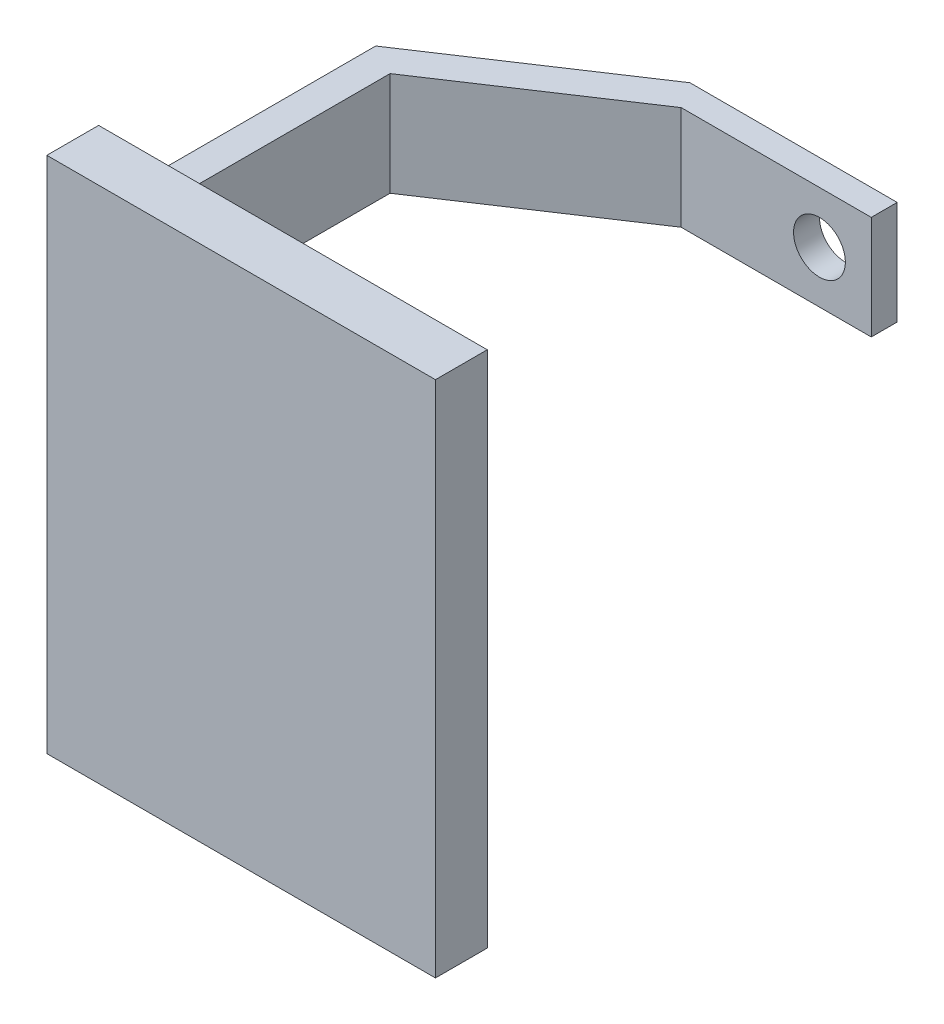
ISO-10303-21;
HEADER;
FILE_DESCRIPTION(('STEP AP214'),'2;1');
FILE_NAME('part.step','',(''),(''),'','','');
FILE_SCHEMA(('AUTOMOTIVE_DESIGN { 1 0 10303 214 1 1 1 1 }'));
ENDSEC;
DATA;
#1=APPLICATION_CONTEXT('core data for automotive mechanical design processes');
#2=APPLICATION_PROTOCOL_DEFINITION('international standard','automotive_design',2000,#1);
#3=PRODUCT_CONTEXT('',#1,'mechanical');
#4=PRODUCT('Part','Part','',(#3));
#5=PRODUCT_RELATED_PRODUCT_CATEGORY('part','',(#4));
#6=PRODUCT_DEFINITION_FORMATION('','',#4);
#7=PRODUCT_DEFINITION_CONTEXT('part definition',#1,'design');
#8=PRODUCT_DEFINITION('design','',#6,#7);
#9=PRODUCT_DEFINITION_SHAPE('','',#8);
#10=(LENGTH_UNIT() NAMED_UNIT(*) SI_UNIT(.MILLI.,.METRE.));
#11=(NAMED_UNIT(*) PLANE_ANGLE_UNIT() SI_UNIT($,.RADIAN.));
#12=(NAMED_UNIT(*) SI_UNIT($,.STERADIAN.) SOLID_ANGLE_UNIT());
#13=UNCERTAINTY_MEASURE_WITH_UNIT(LENGTH_MEASURE(1.E-05),#10,'distance_accuracy_value','');
#14=(GEOMETRIC_REPRESENTATION_CONTEXT(3) GLOBAL_UNCERTAINTY_ASSIGNED_CONTEXT((#13)) GLOBAL_UNIT_ASSIGNED_CONTEXT((#10,
#11,#12)) REPRESENTATION_CONTEXT('',''));
#15=CARTESIAN_POINT('',(0.,0.,0.));
#16=DIRECTION('',(0.,0.,1.));
#17=DIRECTION('',(1.,0.,0.));
#18=AXIS2_PLACEMENT_3D('',#15,#16,#17);
#19=CARTESIAN_POINT('',(0.,0.,5.));
#20=DIRECTION('',(0.,0.,-1.));
#21=DIRECTION('',(-1.,0.,0.));
#22=AXIS2_PLACEMENT_3D('',#19,#20,#21);
#23=PLANE('',#22);
#24=DIRECTION('',(-1.,0.,0.));
#25=VECTOR('',#24,1.);
#26=CARTESIAN_POINT('',(10.,10.,5.));
#27=LINE('',#26,#25);
#28=CARTESIAN_POINT('',(10.,10.,5.));
#29=VERTEX_POINT('',#28);
#30=CARTESIAN_POINT('',(-26.6833752096446,10.,5.));
#31=VERTEX_POINT('',#30);
#32=EDGE_CURVE('E55',#29,#31,#27,.T.);
#33=ORIENTED_EDGE('',*,*,#32,.T.);
#34=DIRECTION('',(0.,-1.,0.));
#35=VECTOR('',#34,1.);
#36=CARTESIAN_POINT('',(-26.6833752096446,162.796467718912,5.));
#37=LINE('',#36,#35);
#38=CARTESIAN_POINT('',(-26.6833752096446,-10.,5.));
#39=VERTEX_POINT('',#38);
#40=EDGE_CURVE('E50',#31,#39,#37,.T.);
#41=ORIENTED_EDGE('',*,*,#40,.T.);
#42=DIRECTION('',(1.,0.,0.));
#43=VECTOR('',#42,1.);
#44=CARTESIAN_POINT('',(10.,-10.,5.));
#45=LINE('',#44,#43);
#46=CARTESIAN_POINT('',(10.,-10.,5.));
#47=VERTEX_POINT('',#46);
#48=EDGE_CURVE('E255',#39,#47,#45,.T.);
#49=ORIENTED_EDGE('',*,*,#48,.T.);
#50=DIRECTION('',(0.,1.,0.));
#51=VECTOR('',#50,1.);
#52=CARTESIAN_POINT('',(10.,10.,5.));
#53=LINE('',#52,#51);
#54=EDGE_CURVE('E257',#47,#29,#53,.T.);
#55=ORIENTED_EDGE('',*,*,#54,.T.);
#56=EDGE_LOOP('',(#33,#41,#49,#55));
#57=FACE_BOUND('',#56,.T.);
#58=CARTESIAN_POINT('',(0.,0.,5.));
#59=DIRECTION('',(0.,0.,1.));
#60=DIRECTION('',(1.,0.,0.));
#61=AXIS2_PLACEMENT_3D('',#58,#59,#60);
#62=CIRCLE('',#61,5.);
#63=CARTESIAN_POINT('',(5.,0.,5.));
#64=VERTEX_POINT('',#63);
#65=EDGE_CURVE('E249',#64,#64,#62,.T.);
#66=ORIENTED_EDGE('',*,*,#65,.F.);
#67=EDGE_LOOP('',(#66));
#68=FACE_BOUND('',#67,.T.);
#69=ADVANCED_FACE('F35',(#57,#68),#23,.F.);
#70=CARTESIAN_POINT('',(0.,0.,0.));
#71=DIRECTION('',(0.,0.,-1.));
#72=DIRECTION('',(-1.,0.,0.));
#73=AXIS2_PLACEMENT_3D('',#70,#71,#72);
#74=PLANE('',#73);
#75=DIRECTION('',(1.,0.,0.));
#76=VECTOR('',#75,1.);
#77=CARTESIAN_POINT('',(10.,-10.,0.));
#78=LINE('',#77,#76);
#79=CARTESIAN_POINT('',(-30.,-10.,0.));
#80=VERTEX_POINT('',#79);
#81=CARTESIAN_POINT('',(10.,-10.,0.));
#82=VERTEX_POINT('',#81);
#83=EDGE_CURVE('E252',#80,#82,#78,.T.);
#84=ORIENTED_EDGE('',*,*,#83,.F.);
#85=DIRECTION('',(0.,-1.,0.));
#86=VECTOR('',#85,1.);
#87=CARTESIAN_POINT('',(-30.,10.,0.));
#88=LINE('',#87,#86);
#89=CARTESIAN_POINT('',(-30.,10.,0.));
#90=VERTEX_POINT('',#89);
#91=EDGE_CURVE('E215',#90,#80,#88,.T.);
#92=ORIENTED_EDGE('',*,*,#91,.F.);
#93=DIRECTION('',(-1.,0.,0.));
#94=VECTOR('',#93,1.);
#95=CARTESIAN_POINT('',(10.,10.,0.));
#96=LINE('',#95,#94);
#97=CARTESIAN_POINT('',(10.,10.,0.));
#98=VERTEX_POINT('',#97);
#99=EDGE_CURVE('E258',#98,#90,#96,.T.);
#100=ORIENTED_EDGE('',*,*,#99,.F.);
#101=DIRECTION('',(0.,1.,0.));
#102=VECTOR('',#101,1.);
#103=CARTESIAN_POINT('',(10.,10.,0.));
#104=LINE('',#103,#102);
#105=EDGE_CURVE('E262',#82,#98,#104,.T.);
#106=ORIENTED_EDGE('',*,*,#105,.F.);
#107=EDGE_LOOP('',(#84,#92,#100,#106));
#108=FACE_BOUND('',#107,.T.);
#109=CARTESIAN_POINT('',(0.,0.,0.));
#110=DIRECTION('',(0.,0.,1.));
#111=DIRECTION('',(1.,0.,0.));
#112=AXIS2_PLACEMENT_3D('',#109,#110,#111);
#113=CIRCLE('',#112,5.);
#114=CARTESIAN_POINT('',(5.,0.,0.));
#115=VERTEX_POINT('',#114);
#116=EDGE_CURVE('E248',#115,#115,#113,.T.);
#117=ORIENTED_EDGE('',*,*,#116,.T.);
#118=EDGE_LOOP('',(#117));
#119=FACE_BOUND('',#118,.T.);
#120=ADVANCED_FACE('F274',(#108,#119),#74,.T.);
#121=CARTESIAN_POINT('',(10.,-10.,5.));
#122=DIRECTION('',(0.,1.,0.));
#123=DIRECTION('',(-1.,0.,0.));
#124=AXIS2_PLACEMENT_3D('',#121,#122,#123);
#125=PLANE('',#124);
#126=DIRECTION('',(0.552770798392566,0.,0.833333333333334));
#127=VECTOR('',#126,1.);
#128=CARTESIAN_POINT('',(-75.3230460875867,-10.,49.9636563878344));
#129=LINE('',#128,#127);
#130=CARTESIAN_POINT('',(-60.4575961545631,-10.,72.3741653731313));
#131=VERTEX_POINT('',#130);
#132=CARTESIAN_POINT('',(-39.3578474124308,-10.,104.183233440598));
#133=VERTEX_POINT('',#132);
#134=EDGE_CURVE('E152',#131,#133,#129,.T.);
#135=ORIENTED_EDGE('',*,*,#134,.T.);
#136=DIRECTION('',(-1.,0.,0.));
#137=VECTOR('',#136,1.);
#138=CARTESIAN_POINT('',(10.,-10.,104.183233440598));
#139=LINE('',#138,#137);
#140=CARTESIAN_POINT('',(-39.9245978317199,-10.,104.183233440598));
#141=VERTEX_POINT('',#140);
#142=EDGE_CURVE('E184',#133,#141,#139,.T.);
#143=ORIENTED_EDGE('',*,*,#142,.T.);
#144=DIRECTION('',(0.,0.,1.));
#145=VECTOR('',#144,1.);
#146=CARTESIAN_POINT('',(-39.9245978317199,-10.,5.));
#147=LINE('',#146,#145);
#148=CARTESIAN_POINT('',(-39.9245978317199,-10.,114.183233440598));
#149=VERTEX_POINT('',#148);
#150=EDGE_CURVE('E195',#141,#149,#147,.T.);
#151=ORIENTED_EDGE('',*,*,#150,.T.);
#152=DIRECTION('',(0.552770798392566,0.,0.833333333333334));
#153=VECTOR('',#152,1.);
#154=CARTESIAN_POINT('',(-80.3230460875867,-10.,53.2802811781898));
#155=LINE('',#154,#153);
#156=CARTESIAN_POINT('',(-66.4575961545632,-10.,74.1832334405978));
#157=VERTEX_POINT('',#156);
#158=EDGE_CURVE('E198',#157,#149,#155,.T.);
#159=ORIENTED_EDGE('',*,*,#158,.F.);
#160=DIRECTION('',(0.,0.,1.));
#161=VECTOR('',#160,1.);
#162=CARTESIAN_POINT('',(-66.457596154563,-10.,-1.66011195177082E-13));
#163=LINE('',#162,#161);
#164=CARTESIAN_POINT('',(-66.4575961545631,-10.,24.1832334405979));
#165=VERTEX_POINT('',#164);
#166=EDGE_CURVE('E218',#165,#157,#163,.T.);
#167=ORIENTED_EDGE('',*,*,#166,.F.);
#168=DIRECTION('',(-0.833333333333333,0.,0.552770798392567));
#169=VECTOR('',#168,1.);
#170=CARTESIAN_POINT('',(-9.16666666666666,-10.,-13.8192699598142));
#171=LINE('',#170,#169);
#172=EDGE_CURVE('E221',#80,#165,#171,.T.);
#173=ORIENTED_EDGE('',*,*,#172,.F.);
#174=ORIENTED_EDGE('',*,*,#83,.T.);
#175=DIRECTION('',(0.,0.,-1.));
#176=VECTOR('',#175,1.);
#177=CARTESIAN_POINT('',(10.,-10.,5.));
#178=LINE('',#177,#176);
#179=EDGE_CURVE('E11',#47,#82,#178,.T.);
#180=ORIENTED_EDGE('',*,*,#179,.F.);
#181=ORIENTED_EDGE('',*,*,#48,.F.);
#182=DIRECTION('',(-0.833333333333333,0.,0.552770798392567));
#183=VECTOR('',#182,1.);
#184=CARTESIAN_POINT('',(-5.85004187631126,-10.,-8.81926995981417));
#185=LINE('',#184,#183);
#186=CARTESIAN_POINT('',(-60.4575961545631,-10.,27.4032836921714));
#187=VERTEX_POINT('',#186);
#188=EDGE_CURVE('E224',#39,#187,#185,.T.);
#189=ORIENTED_EDGE('',*,*,#188,.T.);
#190=DIRECTION('',(0.,0.,1.));
#191=VECTOR('',#190,1.);
#192=CARTESIAN_POINT('',(-60.4575961545631,-10.,0.));
#193=LINE('',#192,#191);
#194=EDGE_CURVE('E227',#187,#131,#193,.T.);
#195=ORIENTED_EDGE('',*,*,#194,.T.);
#196=EDGE_LOOP('',(#135,#143,#151,#159,#167,#173,#174,#180,#181,#189,#195));
#197=FACE_BOUND('',#196,.T.);
#198=ADVANCED_FACE('F37',(#197),#125,.F.);
#199=CARTESIAN_POINT('',(10.,10.,5.));
#200=DIRECTION('',(-1.,0.,0.));
#201=DIRECTION('',(0.,-1.,0.));
#202=AXIS2_PLACEMENT_3D('',#199,#200,#201);
#203=PLANE('',#202);
#204=ORIENTED_EDGE('',*,*,#105,.T.);
#205=DIRECTION('',(0.,0.,-1.));
#206=VECTOR('',#205,1.);
#207=CARTESIAN_POINT('',(10.,10.,5.));
#208=LINE('',#207,#206);
#209=EDGE_CURVE('E43',#29,#98,#208,.T.);
#210=ORIENTED_EDGE('',*,*,#209,.F.);
#211=ORIENTED_EDGE('',*,*,#54,.F.);
#212=ORIENTED_EDGE('',*,*,#179,.T.);
#213=EDGE_LOOP('',(#204,#210,#211,#212));
#214=FACE_BOUND('',#213,.T.);
#215=ADVANCED_FACE('F314',(#214),#203,.F.);
#216=CARTESIAN_POINT('',(10.,10.,5.));
#217=DIRECTION('',(0.,-1.,0.));
#218=DIRECTION('',(0.,0.,-1.));
#219=AXIS2_PLACEMENT_3D('',#216,#217,#218);
#220=PLANE('',#219);
#221=DIRECTION('',(0.,0.,-1.));
#222=VECTOR('',#221,1.);
#223=CARTESIAN_POINT('',(-39.9245978317199,10.,5.));
#224=LINE('',#223,#222);
#225=CARTESIAN_POINT('',(-39.9245978317199,10.,114.183233440598));
#226=VERTEX_POINT('',#225);
#227=CARTESIAN_POINT('',(-39.9245978317199,10.,104.183233440598));
#228=VERTEX_POINT('',#227);
#229=EDGE_CURVE('E190',#226,#228,#224,.T.);
#230=ORIENTED_EDGE('',*,*,#229,.T.);
#231=DIRECTION('',(1.,0.,0.));
#232=VECTOR('',#231,1.);
#233=CARTESIAN_POINT('',(10.,10.,104.183233440598));
#234=LINE('',#233,#232);
#235=CARTESIAN_POINT('',(-39.3578474124308,10.,104.183233440598));
#236=VERTEX_POINT('',#235);
#237=EDGE_CURVE('E188',#228,#236,#234,.T.);
#238=ORIENTED_EDGE('',*,*,#237,.T.);
#239=DIRECTION('',(-0.552770798392566,0.,-0.833333333333334));
#240=VECTOR('',#239,1.);
#241=CARTESIAN_POINT('',(-75.3230460875867,10.,49.9636563878344));
#242=LINE('',#241,#240);
#243=CARTESIAN_POINT('',(-60.4575961545631,10.,72.3741653731313));
#244=VERTEX_POINT('',#243);
#245=EDGE_CURVE('E213',#236,#244,#242,.T.);
#246=ORIENTED_EDGE('',*,*,#245,.T.);
#247=DIRECTION('',(0.,0.,-1.));
#248=VECTOR('',#247,1.);
#249=CARTESIAN_POINT('',(-60.4575961545631,10.,0.));
#250=LINE('',#249,#248);
#251=CARTESIAN_POINT('',(-60.4575961545631,10.,27.4032836921715));
#252=VERTEX_POINT('',#251);
#253=EDGE_CURVE('E211',#244,#252,#250,.T.);
#254=ORIENTED_EDGE('',*,*,#253,.T.);
#255=DIRECTION('',(0.833333333333333,0.,-0.552770798392567));
#256=VECTOR('',#255,1.);
#257=CARTESIAN_POINT('',(-5.85004187631129,10.,-8.81926995981415));
#258=LINE('',#257,#256);
#259=EDGE_CURVE('E209',#252,#31,#258,.T.);
#260=ORIENTED_EDGE('',*,*,#259,.T.);
#261=ORIENTED_EDGE('',*,*,#32,.F.);
#262=ORIENTED_EDGE('',*,*,#209,.T.);
#263=ORIENTED_EDGE('',*,*,#99,.T.);
#264=DIRECTION('',(0.833333333333333,0.,-0.552770798392567));
#265=VECTOR('',#264,1.);
#266=CARTESIAN_POINT('',(-9.16666666666668,10.,-13.8192699598142));
#267=LINE('',#266,#265);
#268=CARTESIAN_POINT('',(-66.4575961545631,10.,24.1832334405979));
#269=VERTEX_POINT('',#268);
#270=EDGE_CURVE('E206',#269,#90,#267,.T.);
#271=ORIENTED_EDGE('',*,*,#270,.F.);
#272=DIRECTION('',(0.,0.,-1.));
#273=VECTOR('',#272,1.);
#274=CARTESIAN_POINT('',(-66.457596154563,10.,-1.66011195177082E-13));
#275=LINE('',#274,#273);
#276=CARTESIAN_POINT('',(-66.4575961545632,10.,74.1832334405978));
#277=VERTEX_POINT('',#276);
#278=EDGE_CURVE('E202',#277,#269,#275,.T.);
#279=ORIENTED_EDGE('',*,*,#278,.F.);
#280=DIRECTION('',(-0.552770798392566,0.,-0.833333333333333));
#281=VECTOR('',#280,1.);
#282=CARTESIAN_POINT('',(-80.3230460875867,10.,53.2802811781898));
#283=LINE('',#282,#281);
#284=EDGE_CURVE('E199',#226,#277,#283,.T.);
#285=ORIENTED_EDGE('',*,*,#284,.F.);
#286=EDGE_LOOP('',(#230,#238,#246,#254,#260,#261,#262,#263,#271,#279,#285));
#287=FACE_BOUND('',#286,.T.);
#288=ADVANCED_FACE('F269',(#287),#220,.F.);
#289=CARTESIAN_POINT('',(0.,0.,5.));
#290=DIRECTION('',(0.,0.,-1.));
#291=DIRECTION('',(-1.,0.,0.));
#292=AXIS2_PLACEMENT_3D('',#289,#290,#291);
#293=CYLINDRICAL_SURFACE('',#292,5.);
#294=ORIENTED_EDGE('',*,*,#65,.T.);
#295=EDGE_LOOP('',(#294));
#296=FACE_BOUND('',#295,.T.);
#297=ORIENTED_EDGE('',*,*,#116,.F.);
#298=EDGE_LOOP('',(#297));
#299=FACE_BOUND('',#298,.T.);
#300=ADVANCED_FACE('F320',(#296,#299),#293,.F.);
#301=CARTESIAN_POINT('',(2.46439903165538E-13,162.796467718912,114.183233440598));
#302=DIRECTION('',(0.,0.,-1.));
#303=DIRECTION('',(-1.,0.,0.));
#304=AXIS2_PLACEMENT_3D('',#301,#302,#303);
#305=PLANE('',#304);
#306=DIRECTION('',(0.,-1.,0.));
#307=VECTOR('',#306,1.);
#308=CARTESIAN_POINT('',(35.0754021682797,162.796467718912,114.183233440598));
#309=LINE('',#308,#307);
#310=CARTESIAN_POINT('',(35.0754021682797,50.,114.183233440598));
#311=VERTEX_POINT('',#310);
#312=CARTESIAN_POINT('',(35.0754021682797,-50.,114.183233440598));
#313=VERTEX_POINT('',#312);
#314=EDGE_CURVE('E141',#311,#313,#309,.T.);
#315=ORIENTED_EDGE('',*,*,#314,.F.);
#316=DIRECTION('',(-1.,0.,0.));
#317=VECTOR('',#316,1.);
#318=CARTESIAN_POINT('',(35.0754021682797,50.,114.183233440598));
#319=LINE('',#318,#317);
#320=CARTESIAN_POINT('',(-39.9245978317199,50.,114.183233440598));
#321=VERTEX_POINT('',#320);
#322=EDGE_CURVE('E173',#311,#321,#319,.T.);
#323=ORIENTED_EDGE('',*,*,#322,.T.);
#324=DIRECTION('',(0.,-1.,0.));
#325=VECTOR('',#324,1.);
#326=CARTESIAN_POINT('',(-39.9245978317199,50.,114.183233440598));
#327=LINE('',#326,#325);
#328=EDGE_CURVE('E186',#321,#226,#327,.T.);
#329=ORIENTED_EDGE('',*,*,#328,.T.);
#330=DIRECTION('',(0.,-1.,0.));
#331=VECTOR('',#330,1.);
#332=CARTESIAN_POINT('',(-39.9245978317199,162.796467718912,114.183233440598));
#333=LINE('',#332,#331);
#334=EDGE_CURVE('E151',#226,#149,#333,.T.);
#335=ORIENTED_EDGE('',*,*,#334,.T.);
#336=CARTESIAN_POINT('',(-39.9245978317199,-50.,114.183233440598));
#337=VERTEX_POINT('',#336);
#338=EDGE_CURVE('E158',#149,#337,#327,.T.);
#339=ORIENTED_EDGE('',*,*,#338,.T.);
#340=DIRECTION('',(-1.,0.,0.));
#341=VECTOR('',#340,1.);
#342=CARTESIAN_POINT('',(35.0754021682797,-50.,114.183233440598));
#343=LINE('',#342,#341);
#344=EDGE_CURVE('E155',#313,#337,#343,.T.);
#345=ORIENTED_EDGE('',*,*,#344,.F.);
#346=EDGE_LOOP('',(#315,#323,#329,#335,#339,#345));
#347=FACE_BOUND('',#346,.T.);
#348=ADVANCED_FACE('F156',(#347),#305,.F.);
#349=CARTESIAN_POINT('',(-80.3230460875867,162.796467718912,53.2802811781898));
#350=DIRECTION('',(0.833333333333334,0.,-0.552770798392566));
#351=DIRECTION('',(-0.552770798392566,0.,-0.833333333333333));
#352=AXIS2_PLACEMENT_3D('',#349,#350,#351);
#353=PLANE('',#352);
#354=ORIENTED_EDGE('',*,*,#334,.F.);
#355=ORIENTED_EDGE('',*,*,#284,.T.);
#356=DIRECTION('',(0.,-1.,0.));
#357=VECTOR('',#356,1.);
#358=CARTESIAN_POINT('',(-66.4575961545632,162.796467718912,74.1832334405978));
#359=LINE('',#358,#357);
#360=EDGE_CURVE('E243',#277,#157,#359,.T.);
#361=ORIENTED_EDGE('',*,*,#360,.T.);
#362=ORIENTED_EDGE('',*,*,#158,.T.);
#363=EDGE_LOOP('',(#354,#355,#361,#362));
#364=FACE_BOUND('',#363,.T.);
#365=ADVANCED_FACE('F291',(#364),#353,.F.);
#366=CARTESIAN_POINT('',(-66.4575961545631,162.796467718912,-1.66011195177082E-13));
#367=DIRECTION('',(1.,0.,0.));
#368=DIRECTION('',(0.,0.,-1.));
#369=AXIS2_PLACEMENT_3D('',#366,#367,#368);
#370=PLANE('',#369);
#371=ORIENTED_EDGE('',*,*,#360,.F.);
#372=ORIENTED_EDGE('',*,*,#278,.T.);
#373=DIRECTION('',(0.,-1.,0.));
#374=VECTOR('',#373,1.);
#375=CARTESIAN_POINT('',(-66.4575961545631,162.796467718912,24.1832334405979));
#376=LINE('',#375,#374);
#377=EDGE_CURVE('E241',#269,#165,#376,.T.);
#378=ORIENTED_EDGE('',*,*,#377,.T.);
#379=ORIENTED_EDGE('',*,*,#166,.T.);
#380=EDGE_LOOP('',(#371,#372,#378,#379));
#381=FACE_BOUND('',#380,.T.);
#382=ADVANCED_FACE('F286',(#381),#370,.F.);
#383=CARTESIAN_POINT('',(-9.16666666666669,162.796467718912,-13.8192699598142));
#384=DIRECTION('',(0.552770798392567,0.,0.833333333333333));
#385=DIRECTION('',(0.833333333333333,0.,-0.552770798392567));
#386=AXIS2_PLACEMENT_3D('',#383,#384,#385);
#387=PLANE('',#386);
#388=ORIENTED_EDGE('',*,*,#377,.F.);
#389=ORIENTED_EDGE('',*,*,#270,.T.);
#390=ORIENTED_EDGE('',*,*,#91,.T.);
#391=ORIENTED_EDGE('',*,*,#172,.T.);
#392=EDGE_LOOP('',(#388,#389,#390,#391));
#393=FACE_BOUND('',#392,.T.);
#394=ADVANCED_FACE('F279',(#393),#387,.F.);
#395=CARTESIAN_POINT('',(-5.85004187631129,162.796467718912,-8.81926995981417));
#396=DIRECTION('',(0.552770798392567,0.,0.833333333333333));
#397=DIRECTION('',(0.833333333333333,0.,-0.552770798392567));
#398=AXIS2_PLACEMENT_3D('',#395,#396,#397);
#399=PLANE('',#398);
#400=ORIENTED_EDGE('',*,*,#259,.F.);
#401=DIRECTION('',(0.,-1.,0.));
#402=VECTOR('',#401,1.);
#403=CARTESIAN_POINT('',(-60.4575961545631,162.796467718912,27.4032836921714));
#404=LINE('',#403,#402);
#405=EDGE_CURVE('E238',#252,#187,#404,.T.);
#406=ORIENTED_EDGE('',*,*,#405,.T.);
#407=ORIENTED_EDGE('',*,*,#188,.F.);
#408=ORIENTED_EDGE('',*,*,#40,.F.);
#409=EDGE_LOOP('',(#400,#406,#407,#408));
#410=FACE_BOUND('',#409,.T.);
#411=ADVANCED_FACE('F312',(#410),#399,.T.);
#412=CARTESIAN_POINT('',(-60.4575961545631,162.796467718912,0.));
#413=DIRECTION('',(1.,0.,0.));
#414=DIRECTION('',(0.,0.,-1.));
#415=AXIS2_PLACEMENT_3D('',#412,#413,#414);
#416=PLANE('',#415);
#417=ORIENTED_EDGE('',*,*,#253,.F.);
#418=DIRECTION('',(0.,-1.,0.));
#419=VECTOR('',#418,1.);
#420=CARTESIAN_POINT('',(-60.4575961545631,162.796467718912,72.3741653731313));
#421=LINE('',#420,#419);
#422=EDGE_CURVE('E236',#244,#131,#421,.T.);
#423=ORIENTED_EDGE('',*,*,#422,.T.);
#424=ORIENTED_EDGE('',*,*,#194,.F.);
#425=ORIENTED_EDGE('',*,*,#405,.F.);
#426=EDGE_LOOP('',(#417,#423,#424,#425));
#427=FACE_BOUND('',#426,.T.);
#428=ADVANCED_FACE('F308',(#427),#416,.T.);
#429=CARTESIAN_POINT('',(-75.3230460875867,162.796467718912,49.9636563878344));
#430=DIRECTION('',(0.833333333333334,0.,-0.552770798392566));
#431=DIRECTION('',(-0.552770798392566,0.,-0.833333333333334));
#432=AXIS2_PLACEMENT_3D('',#429,#430,#431);
#433=PLANE('',#432);
#434=ORIENTED_EDGE('',*,*,#245,.F.);
#435=DIRECTION('',(0.,-1.,0.));
#436=VECTOR('',#435,1.);
#437=CARTESIAN_POINT('',(-39.3578474124309,162.796467718912,104.183233440598));
#438=LINE('',#437,#436);
#439=EDGE_CURVE('E233',#236,#133,#438,.T.);
#440=ORIENTED_EDGE('',*,*,#439,.T.);
#441=ORIENTED_EDGE('',*,*,#134,.F.);
#442=ORIENTED_EDGE('',*,*,#422,.F.);
#443=EDGE_LOOP('',(#434,#440,#441,#442));
#444=FACE_BOUND('',#443,.T.);
#445=ADVANCED_FACE('F305',(#444),#433,.T.);
#446=CARTESIAN_POINT('',(0.,162.796467718912,104.183233440598));
#447=DIRECTION('',(0.,0.,-1.));
#448=DIRECTION('',(-1.,0.,0.));
#449=AXIS2_PLACEMENT_3D('',#446,#447,#448);
#450=PLANE('',#449);
#451=ORIENTED_EDGE('',*,*,#439,.F.);
#452=ORIENTED_EDGE('',*,*,#237,.F.);
#453=DIRECTION('',(0.,-1.,0.));
#454=VECTOR('',#453,1.);
#455=CARTESIAN_POINT('',(-39.9245978317199,50.,104.183233440598));
#456=LINE('',#455,#454);
#457=CARTESIAN_POINT('',(-39.9245978317199,50.,104.183233440598));
#458=VERTEX_POINT('',#457);
#459=EDGE_CURVE('E181',#458,#228,#456,.T.);
#460=ORIENTED_EDGE('',*,*,#459,.F.);
#461=DIRECTION('',(1.,0.,0.));
#462=VECTOR('',#461,1.);
#463=CARTESIAN_POINT('',(35.0754021682797,50.,104.183233440598));
#464=LINE('',#463,#462);
#465=CARTESIAN_POINT('',(35.0754021682797,50.,104.183233440598));
#466=VERTEX_POINT('',#465);
#467=EDGE_CURVE('E178',#458,#466,#464,.T.);
#468=ORIENTED_EDGE('',*,*,#467,.T.);
#469=DIRECTION('',(0.,-1.,0.));
#470=VECTOR('',#469,1.);
#471=CARTESIAN_POINT('',(35.0754021682797,162.796467718912,104.183233440598));
#472=LINE('',#471,#470);
#473=CARTESIAN_POINT('',(35.0754021682797,-50.,104.183233440598));
#474=VERTEX_POINT('',#473);
#475=EDGE_CURVE('E203',#466,#474,#472,.T.);
#476=ORIENTED_EDGE('',*,*,#475,.T.);
#477=DIRECTION('',(1.,0.,0.));
#478=VECTOR('',#477,1.);
#479=CARTESIAN_POINT('',(35.0754021682797,-50.,104.183233440598));
#480=LINE('',#479,#478);
#481=CARTESIAN_POINT('',(-39.9245978317199,-50.,104.183233440598));
#482=VERTEX_POINT('',#481);
#483=EDGE_CURVE('E167',#482,#474,#480,.T.);
#484=ORIENTED_EDGE('',*,*,#483,.F.);
#485=EDGE_CURVE('E185',#141,#482,#456,.T.);
#486=ORIENTED_EDGE('',*,*,#485,.F.);
#487=ORIENTED_EDGE('',*,*,#142,.F.);
#488=EDGE_LOOP('',(#451,#452,#460,#468,#476,#484,#486,#487));
#489=FACE_BOUND('',#488,.T.);
#490=ADVANCED_FACE('F298',(#489),#450,.T.);
#491=CARTESIAN_POINT('',(35.0754021682797,162.796467718912,0.));
#492=DIRECTION('',(-1.,0.,0.));
#493=DIRECTION('',(0.,-1.,0.));
#494=AXIS2_PLACEMENT_3D('',#491,#492,#493);
#495=PLANE('',#494);
#496=ORIENTED_EDGE('',*,*,#475,.F.);
#497=DIRECTION('',(0.,0.,1.));
#498=VECTOR('',#497,1.);
#499=CARTESIAN_POINT('',(35.0754021682797,50.,104.183233440598));
#500=LINE('',#499,#498);
#501=EDGE_CURVE('E147',#466,#311,#500,.T.);
#502=ORIENTED_EDGE('',*,*,#501,.T.);
#503=ORIENTED_EDGE('',*,*,#314,.T.);
#504=DIRECTION('',(0.,0.,1.));
#505=VECTOR('',#504,1.);
#506=CARTESIAN_POINT('',(35.0754021682797,-50.,104.183233440598));
#507=LINE('',#506,#505);
#508=EDGE_CURVE('E145',#474,#313,#507,.T.);
#509=ORIENTED_EDGE('',*,*,#508,.F.);
#510=EDGE_LOOP('',(#496,#502,#503,#509));
#511=FACE_BOUND('',#510,.T.);
#512=ADVANCED_FACE('F143',(#511),#495,.F.);
#513=CARTESIAN_POINT('',(0.,50.,0.));
#514=DIRECTION('',(0.,-1.,0.));
#515=DIRECTION('',(1.,0.,0.));
#516=AXIS2_PLACEMENT_3D('',#513,#514,#515);
#517=PLANE('',#516);
#518=ORIENTED_EDGE('',*,*,#501,.F.);
#519=ORIENTED_EDGE('',*,*,#467,.F.);
#520=DIRECTION('',(0.,0.,-1.));
#521=VECTOR('',#520,1.);
#522=CARTESIAN_POINT('',(-39.9245978317199,50.,104.183233440598));
#523=LINE('',#522,#521);
#524=EDGE_CURVE('E175',#321,#458,#523,.T.);
#525=ORIENTED_EDGE('',*,*,#524,.F.);
#526=ORIENTED_EDGE('',*,*,#322,.F.);
#527=EDGE_LOOP('',(#518,#519,#525,#526));
#528=FACE_BOUND('',#527,.T.);
#529=ADVANCED_FACE('F334',(#528),#517,.F.);
#530=CARTESIAN_POINT('',(-39.9245978317199,50.,104.183233440598));
#531=DIRECTION('',(-1.,0.,0.));
#532=DIRECTION('',(0.,-1.,0.));
#533=AXIS2_PLACEMENT_3D('',#530,#531,#532);
#534=PLANE('',#533);
#535=ORIENTED_EDGE('',*,*,#229,.F.);
#536=ORIENTED_EDGE('',*,*,#328,.F.);
#537=ORIENTED_EDGE('',*,*,#524,.T.);
#538=ORIENTED_EDGE('',*,*,#459,.T.);
#539=EDGE_LOOP('',(#535,#536,#537,#538));
#540=FACE_BOUND('',#539,.T.);
#541=ADVANCED_FACE('F294',(#540),#534,.T.);
#542=ORIENTED_EDGE('',*,*,#150,.F.);
#543=ORIENTED_EDGE('',*,*,#485,.T.);
#544=DIRECTION('',(0.,0.,-1.));
#545=VECTOR('',#544,1.);
#546=CARTESIAN_POINT('',(-39.9245978317199,-50.,104.183233440598));
#547=LINE('',#546,#545);
#548=EDGE_CURVE('E162',#337,#482,#547,.T.);
#549=ORIENTED_EDGE('',*,*,#548,.F.);
#550=ORIENTED_EDGE('',*,*,#338,.F.);
#551=EDGE_LOOP('',(#542,#543,#549,#550));
#552=FACE_BOUND('',#551,.T.);
#553=ADVANCED_FACE('F351',(#552),#534,.T.);
#554=CARTESIAN_POINT('',(0.,-50.,0.));
#555=DIRECTION('',(0.,-1.,0.));
#556=DIRECTION('',(1.,0.,0.));
#557=AXIS2_PLACEMENT_3D('',#554,#555,#556);
#558=PLANE('',#557);
#559=ORIENTED_EDGE('',*,*,#508,.T.);
#560=ORIENTED_EDGE('',*,*,#344,.T.);
#561=ORIENTED_EDGE('',*,*,#548,.T.);
#562=ORIENTED_EDGE('',*,*,#483,.T.);
#563=EDGE_LOOP('',(#559,#560,#561,#562));
#564=FACE_BOUND('',#563,.T.);
#565=ADVANCED_FACE('F165',(#564),#558,.T.);
#566=CLOSED_SHELL('',(#69,#120,#198,#215,#288,#300,#348,#365,#382,#394,#411,#428,#445,#490,#512,
#529,#541,#553,#565));
#567=MANIFOLD_SOLID_BREP('B2',#566);
#568=ADVANCED_BREP_SHAPE_REPRESENTATION('',(#18,#567),#14);
#569=SHAPE_DEFINITION_REPRESENTATION(#9,#568);
ENDSEC;
END-ISO-10303-21;
